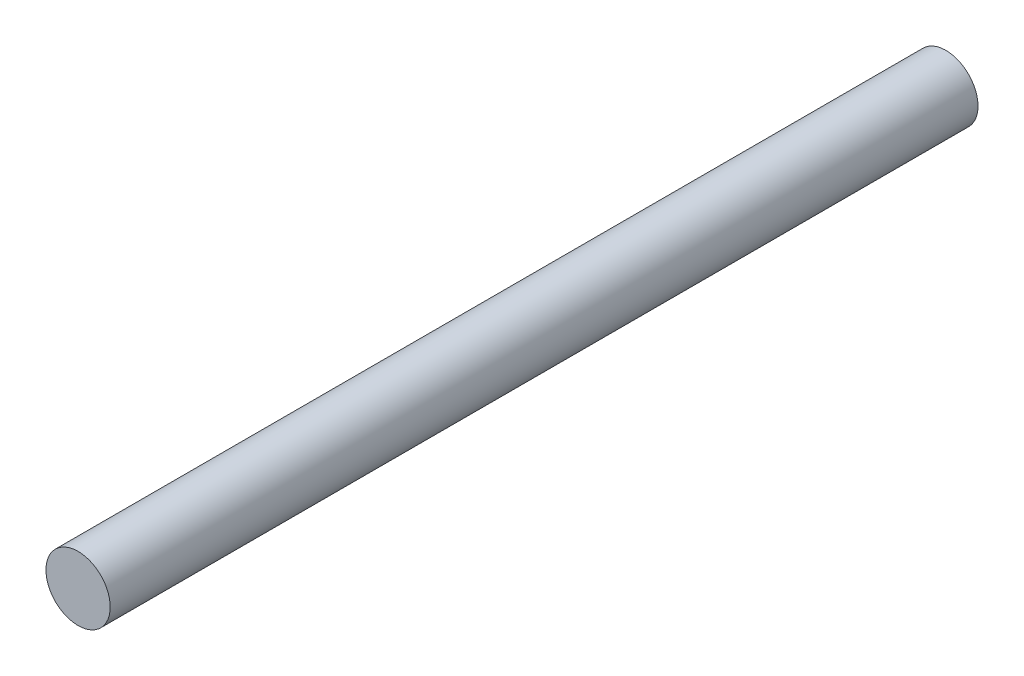
ISO-10303-21;
HEADER;
FILE_DESCRIPTION(('STEP AP214'),'2;1');
FILE_NAME('part.step','',(''),(''),'','','');
FILE_SCHEMA(('AUTOMOTIVE_DESIGN { 1 0 10303 214 1 1 1 1 }'));
ENDSEC;
DATA;
#1=APPLICATION_CONTEXT('core data for automotive mechanical design processes');
#2=APPLICATION_PROTOCOL_DEFINITION('international standard','automotive_design',2000,#1);
#3=PRODUCT_CONTEXT('',#1,'mechanical');
#4=PRODUCT('Part','Part','',(#3));
#5=PRODUCT_RELATED_PRODUCT_CATEGORY('part','',(#4));
#6=PRODUCT_DEFINITION_FORMATION('','',#4);
#7=PRODUCT_DEFINITION_CONTEXT('part definition',#1,'design');
#8=PRODUCT_DEFINITION('design','',#6,#7);
#9=PRODUCT_DEFINITION_SHAPE('','',#8);
#10=(LENGTH_UNIT() NAMED_UNIT(*) SI_UNIT(.MILLI.,.METRE.));
#11=(NAMED_UNIT(*) PLANE_ANGLE_UNIT() SI_UNIT($,.RADIAN.));
#12=(NAMED_UNIT(*) SI_UNIT($,.STERADIAN.) SOLID_ANGLE_UNIT());
#13=UNCERTAINTY_MEASURE_WITH_UNIT(LENGTH_MEASURE(1.E-05),#10,'distance_accuracy_value','');
#14=(GEOMETRIC_REPRESENTATION_CONTEXT(3) GLOBAL_UNCERTAINTY_ASSIGNED_CONTEXT((#13)) GLOBAL_UNIT_ASSIGNED_CONTEXT((#10,
#11,#12)) REPRESENTATION_CONTEXT('',''));
#15=CARTESIAN_POINT('',(0.,0.,0.));
#16=DIRECTION('',(0.,0.,1.));
#17=DIRECTION('',(1.,0.,0.));
#18=AXIS2_PLACEMENT_3D('',#15,#16,#17);
#19=CARTESIAN_POINT('',(0.,0.,67.5));
#20=DIRECTION('',(0.,0.,-1.));
#21=DIRECTION('',(-1.,0.,0.));
#22=AXIS2_PLACEMENT_3D('',#19,#20,#21);
#23=CYLINDRICAL_SURFACE('',#22,5.);
#24=CARTESIAN_POINT('',(0.,0.,67.5));
#25=DIRECTION('',(0.,0.,1.));
#26=DIRECTION('',(1.,0.,0.));
#27=AXIS2_PLACEMENT_3D('',#24,#25,#26);
#28=CIRCLE('',#27,5.);
#29=CARTESIAN_POINT('',(5.,0.,67.5));
#30=VERTEX_POINT('',#29);
#31=EDGE_CURVE('E10',#30,#30,#28,.T.);
#32=ORIENTED_EDGE('',*,*,#31,.F.);
#33=EDGE_LOOP('',(#32));
#34=FACE_BOUND('',#33,.T.);
#35=CARTESIAN_POINT('',(0.,0.,-67.5));
#36=DIRECTION('',(0.,0.,1.));
#37=DIRECTION('',(1.,0.,0.));
#38=AXIS2_PLACEMENT_3D('',#35,#36,#37);
#39=CIRCLE('',#38,5.);
#40=CARTESIAN_POINT('',(5.,0.,-67.5));
#41=VERTEX_POINT('',#40);
#42=EDGE_CURVE('E34',#41,#41,#39,.T.);
#43=ORIENTED_EDGE('',*,*,#42,.T.);
#44=EDGE_LOOP('',(#43));
#45=FACE_BOUND('',#44,.T.);
#46=ADVANCED_FACE('F31',(#34,#45),#23,.T.);
#47=CARTESIAN_POINT('',(0.,0.,67.5));
#48=DIRECTION('',(0.,0.,1.));
#49=DIRECTION('',(1.,0.,0.));
#50=AXIS2_PLACEMENT_3D('',#47,#48,#49);
#51=PLANE('',#50);
#52=ORIENTED_EDGE('',*,*,#31,.T.);
#53=EDGE_LOOP('',(#52));
#54=FACE_BOUND('',#53,.T.);
#55=ADVANCED_FACE('F46',(#54),#51,.T.);
#56=CARTESIAN_POINT('',(0.,0.,-67.5));
#57=DIRECTION('',(0.,0.,1.));
#58=DIRECTION('',(1.,0.,0.));
#59=AXIS2_PLACEMENT_3D('',#56,#57,#58);
#60=PLANE('',#59);
#61=ORIENTED_EDGE('',*,*,#42,.F.);
#62=EDGE_LOOP('',(#61));
#63=FACE_BOUND('',#62,.T.);
#64=ADVANCED_FACE('F44',(#63),#60,.F.);
#65=CLOSED_SHELL('',(#46,#55,#64));
#66=MANIFOLD_SOLID_BREP('B2',#65);
#67=ADVANCED_BREP_SHAPE_REPRESENTATION('',(#18,#66),#14);
#68=SHAPE_DEFINITION_REPRESENTATION(#9,#67);
ENDSEC;
END-ISO-10303-21;
